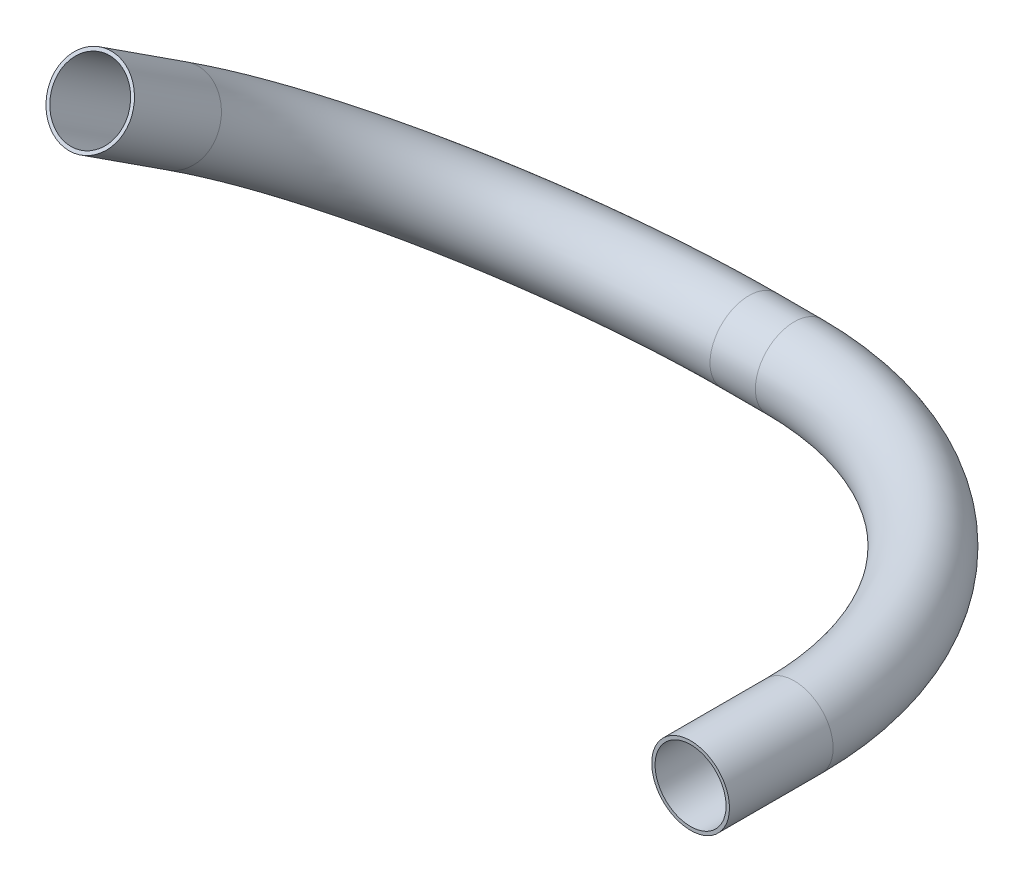
ISO-10303-21;
HEADER;
FILE_DESCRIPTION(('STEP AP214'),'2;1');
FILE_NAME('part.step','',(''),(''),'','','');
FILE_SCHEMA(('AUTOMOTIVE_DESIGN { 1 0 10303 214 1 1 1 1 }'));
ENDSEC;
DATA;
#1=APPLICATION_CONTEXT('core data for automotive mechanical design processes');
#2=APPLICATION_PROTOCOL_DEFINITION('international standard','automotive_design',2000,#1);
#3=PRODUCT_CONTEXT('',#1,'mechanical');
#4=PRODUCT('Part','Part','',(#3));
#5=PRODUCT_RELATED_PRODUCT_CATEGORY('part','',(#4));
#6=PRODUCT_DEFINITION_FORMATION('','',#4);
#7=PRODUCT_DEFINITION_CONTEXT('part definition',#1,'design');
#8=PRODUCT_DEFINITION('design','',#6,#7);
#9=PRODUCT_DEFINITION_SHAPE('','',#8);
#10=(LENGTH_UNIT() NAMED_UNIT(*) SI_UNIT(.MILLI.,.METRE.));
#11=(NAMED_UNIT(*) PLANE_ANGLE_UNIT() SI_UNIT($,.RADIAN.));
#12=(NAMED_UNIT(*) SI_UNIT($,.STERADIAN.) SOLID_ANGLE_UNIT());
#13=UNCERTAINTY_MEASURE_WITH_UNIT(LENGTH_MEASURE(1.E-05),#10,'distance_accuracy_value','');
#14=(GEOMETRIC_REPRESENTATION_CONTEXT(3) GLOBAL_UNCERTAINTY_ASSIGNED_CONTEXT((#13)) GLOBAL_UNIT_ASSIGNED_CONTEXT((#10,
#11,#12)) REPRESENTATION_CONTEXT('',''));
#15=CARTESIAN_POINT('',(0.,0.,0.));
#16=DIRECTION('',(0.,0.,1.));
#17=DIRECTION('',(1.,0.,0.));
#18=AXIS2_PLACEMENT_3D('',#15,#16,#17);
#19=CARTESIAN_POINT('',(174.624999999999,0.,-203.2));
#20=DIRECTION('',(-1.,0.,0.));
#21=DIRECTION('',(0.,0.,1.));
#22=AXIS2_PLACEMENT_3D('',#19,#20,#21);
#23=CYLINDRICAL_SURFACE('',#22,19.05);
#24=CARTESIAN_POINT('',(152.4,0.,-203.2));
#25=DIRECTION('',(-1.,0.,0.));
#26=DIRECTION('',(0.,-0.838670567945423,0.544639035015028));
#27=AXIS2_PLACEMENT_3D('',#24,#25,#26);
#28=CIRCLE('',#27,19.05);
#29=CARTESIAN_POINT('',(152.4,-10.3753736170363,-219.17667431936));
#30=VERTEX_POINT('',#29);
#31=EDGE_CURVE('E175',#30,#30,#28,.T.);
#32=ORIENTED_EDGE('',*,*,#31,.F.);
#33=EDGE_LOOP('',(#32));
#34=FACE_BOUND('',#33,.T.);
#35=CARTESIAN_POINT('',(174.624999999999,0.,-203.2));
#36=DIRECTION('',(-1.,0.,0.));
#37=DIRECTION('',(0.,-0.838670567945423,0.544639035015028));
#38=AXIS2_PLACEMENT_3D('',#35,#36,#37);
#39=CIRCLE('',#38,19.05);
#40=CARTESIAN_POINT('',(174.624999999999,0.,-222.25));
#41=VERTEX_POINT('',#40);
#42=EDGE_CURVE('E197',#41,#41,#39,.T.);
#43=ORIENTED_EDGE('',*,*,#42,.T.);
#44=EDGE_LOOP('',(#43));
#45=FACE_BOUND('',#44,.T.);
#46=ADVANCED_FACE('F145',(#34,#45),#23,.T.);
#47=CARTESIAN_POINT('',(152.4,83.0029889362903,-75.3866054451175));
#48=DIRECTION('',(0.,0.838670567945423,-0.544639035015028));
#49=DIRECTION('',(0.,0.544639035015028,0.838670567945423));
#50=AXIS2_PLACEMENT_3D('',#47,#48,#49);
#51=TOROIDAL_SURFACE('',#50,152.4,19.05);
#52=CARTESIAN_POINT('',(-2.58522689888991E-13,83.0029889362909,-75.3866054451165));
#53=DIRECTION('',(0.,0.544639035015028,0.838670567945423));
#54=DIRECTION('',(0.,-0.838670567945423,0.544639035015028));
#55=AXIS2_PLACEMENT_3D('',#52,#53,#54);
#56=CIRCLE('',#55,19.05);
#57=CARTESIAN_POINT('',(-19.05,83.0029889362909,-75.3866054451164));
#58=VERTEX_POINT('',#57);
#59=EDGE_CURVE('E149',#58,#58,#56,.T.);
#60=CARTESIAN_POINT('',(152.4,83.0029889362903,-75.3866054451175));
#61=DIRECTION('',(0.,0.838670567945423,-0.544639035015028));
#62=DIRECTION('',(0.,0.544639035015028,0.838670567945423));
#63=AXIS2_PLACEMENT_3D('',#60,#61,#62);
#64=CIRCLE('',#63,171.45);
#65=EDGE_CURVE('',#30,#58,#64,.T.);
#66=ORIENTED_EDGE('',*,*,#31,.T.);
#67=ORIENTED_EDGE('',*,*,#59,.F.);
#68=ORIENTED_EDGE('',*,*,#65,.T.);
#69=ORIENTED_EDGE('',*,*,#65,.F.);
#70=EDGE_LOOP('',(#66,#68,#67,#69));
#71=FACE_BOUND('',#70,.T.);
#72=ADVANCED_FACE('F205',(#71),#51,.T.);
#73=CARTESIAN_POINT('',(0.,83.0029889362909,-75.3866054451165));
#74=DIRECTION('',(0.,0.544639035015028,0.838670567945423));
#75=DIRECTION('',(0.,-0.838670567945423,0.544639035015028));
#76=AXIS2_PLACEMENT_3D('',#73,#74,#75);
#77=CYLINDRICAL_SURFACE('',#76,19.05);
#78=CARTESIAN_POINT('',(0.,110.670651915054,-32.78214059349));
#79=DIRECTION('',(0.,0.544639035015028,0.838670567945423));
#80=DIRECTION('',(0.,-0.838670567945423,0.544639035015028));
#81=AXIS2_PLACEMENT_3D('',#78,#79,#80);
#82=CIRCLE('',#81,19.05);
#83=CARTESIAN_POINT('',(0.,94.6939775956934,-22.4067669764537));
#84=VERTEX_POINT('',#83);
#85=EDGE_CURVE('E160',#84,#84,#82,.T.);
#86=ORIENTED_EDGE('',*,*,#85,.F.);
#87=EDGE_LOOP('',(#86));
#88=FACE_BOUND('',#87,.T.);
#89=ORIENTED_EDGE('',*,*,#59,.T.);
#90=EDGE_LOOP('',(#89));
#91=FACE_BOUND('',#90,.T.);
#92=ADVANCED_FACE('F147',(#88,#91),#77,.T.);
#93=CARTESIAN_POINT('',(0.,110.670651915054,-32.78214059349));
#94=DIRECTION('',(0.,0.544639035015028,0.838670567945423));
#95=DIRECTION('',(0.,-0.838670567945423,0.544639035015028));
#96=AXIS2_PLACEMENT_3D('',#93,#94,#95);
#97=PLANE('',#96);
#98=CARTESIAN_POINT('',(0.,110.670651915054,-32.78214059349));
#99=DIRECTION('',(0.,0.544639035015028,0.838670567945423));
#100=DIRECTION('',(0.,-0.838670567945423,0.544639035015028));
#101=AXIS2_PLACEMENT_3D('',#98,#99,#100);
#102=CIRCLE('',#101,17.399);
#103=CARTESIAN_POINT('',(0.,96.0786227033713,-23.3059660232635));
#104=VERTEX_POINT('',#103);
#105=EDGE_CURVE('E13',#104,#104,#102,.F.);
#106=ORIENTED_EDGE('',*,*,#105,.T.);
#107=EDGE_LOOP('',(#106));
#108=FACE_BOUND('',#107,.T.);
#109=ORIENTED_EDGE('',*,*,#85,.T.);
#110=EDGE_LOOP('',(#109));
#111=FACE_BOUND('',#110,.T.);
#112=ADVANCED_FACE('F237',(#108,#111),#97,.T.);
#113=CARTESIAN_POINT('',(174.624999999999,0.,-203.2));
#114=DIRECTION('',(-1.,0.,0.));
#115=DIRECTION('',(0.,0.,1.));
#116=AXIS2_PLACEMENT_3D('',#113,#114,#115);
#117=CYLINDRICAL_SURFACE('',#116,17.399);
#118=CARTESIAN_POINT('',(152.4,0.,-203.2));
#119=DIRECTION('',(-1.,0.,0.));
#120=DIRECTION('',(0.,-0.838670567945423,0.544639035015028));
#121=AXIS2_PLACEMENT_3D('',#118,#119,#120);
#122=CIRCLE('',#121,17.399);
#123=CARTESIAN_POINT('',(152.4,-9.4761745702265,-217.792029211682));
#124=VERTEX_POINT('',#123);
#125=EDGE_CURVE('E191',#124,#124,#122,.F.);
#126=ORIENTED_EDGE('',*,*,#125,.F.);
#127=EDGE_LOOP('',(#126));
#128=FACE_BOUND('',#127,.T.);
#129=CARTESIAN_POINT('',(174.624999999999,0.,-203.2));
#130=DIRECTION('',(-1.,0.,0.));
#131=DIRECTION('',(0.,-0.838670567945423,0.544639035015028));
#132=AXIS2_PLACEMENT_3D('',#129,#130,#131);
#133=CIRCLE('',#132,17.399);
#134=CARTESIAN_POINT('',(174.624999999999,0.,-220.599));
#135=VERTEX_POINT('',#134);
#136=EDGE_CURVE('E188',#135,#135,#133,.F.);
#137=ORIENTED_EDGE('',*,*,#136,.T.);
#138=EDGE_LOOP('',(#137));
#139=FACE_BOUND('',#138,.T.);
#140=ADVANCED_FACE('F232',(#128,#139),#117,.F.);
#141=CARTESIAN_POINT('',(152.4,83.0029889362903,-75.3866054451175));
#142=DIRECTION('',(0.,0.838670567945423,-0.544639035015028));
#143=DIRECTION('',(0.,0.544639035015028,0.838670567945423));
#144=AXIS2_PLACEMENT_3D('',#141,#142,#143);
#145=TOROIDAL_SURFACE('',#144,152.4,17.399);
#146=CARTESIAN_POINT('',(-2.58522689888991E-13,83.0029889362909,-75.3866054451165));
#147=DIRECTION('',(0.,0.544639035015028,0.838670567945423));
#148=DIRECTION('',(0.,-0.838670567945423,0.544639035015028));
#149=AXIS2_PLACEMENT_3D('',#146,#147,#148);
#150=CIRCLE('',#149,17.399);
#151=CARTESIAN_POINT('',(-17.399,83.0029889362909,-75.3866054451164));
#152=VERTEX_POINT('',#151);
#153=EDGE_CURVE('E154',#152,#152,#150,.F.);
#154=CARTESIAN_POINT('',(152.4,83.0029889362903,-75.3866054451175));
#155=DIRECTION('',(0.,0.838670567945423,-0.544639035015028));
#156=DIRECTION('',(0.,0.544639035015028,0.838670567945423));
#157=AXIS2_PLACEMENT_3D('',#154,#155,#156);
#158=CIRCLE('',#157,169.799);
#159=EDGE_CURVE('',#124,#152,#158,.T.);
#160=ORIENTED_EDGE('',*,*,#125,.T.);
#161=ORIENTED_EDGE('',*,*,#153,.F.);
#162=ORIENTED_EDGE('',*,*,#159,.T.);
#163=ORIENTED_EDGE('',*,*,#159,.F.);
#164=EDGE_LOOP('',(#160,#162,#161,#163));
#165=FACE_BOUND('',#164,.T.);
#166=ADVANCED_FACE('F222',(#165),#145,.F.);
#167=CARTESIAN_POINT('',(0.,83.0029889362909,-75.3866054451165));
#168=DIRECTION('',(0.,0.544639035015028,0.838670567945423));
#169=DIRECTION('',(0.,-0.838670567945423,0.544639035015028));
#170=AXIS2_PLACEMENT_3D('',#167,#168,#169);
#171=CYLINDRICAL_SURFACE('',#170,17.399);
#172=ORIENTED_EDGE('',*,*,#105,.F.);
#173=EDGE_LOOP('',(#172));
#174=FACE_BOUND('',#173,.T.);
#175=ORIENTED_EDGE('',*,*,#153,.T.);
#176=EDGE_LOOP('',(#175));
#177=FACE_BOUND('',#176,.T.);
#178=ADVANCED_FACE('F219',(#174,#177),#171,.F.);
#179=CARTESIAN_POINT('',(174.625,0.,-50.8));
#180=DIRECTION('',(0.,-1.,0.));
#181=DIRECTION('',(0.,0.,-1.));
#182=AXIS2_PLACEMENT_3D('',#179,#180,#181);
#183=TOROIDAL_SURFACE('',#182,152.4,19.05);
#184=CARTESIAN_POINT('',(327.025,0.,-50.799999999999));
#185=DIRECTION('',(0.,0.,1.));
#186=DIRECTION('',(1.,0.,0.));
#187=AXIS2_PLACEMENT_3D('',#184,#185,#186);
#188=CIRCLE('',#187,19.05);
#189=CARTESIAN_POINT('',(346.075,0.,-50.7999999999989));
#190=VERTEX_POINT('',#189);
#191=EDGE_CURVE('E185',#190,#190,#188,.T.);
#192=CARTESIAN_POINT('',(174.625,0.,-50.8));
#193=DIRECTION('',(0.,-1.,0.));
#194=DIRECTION('',(0.,0.,-1.));
#195=AXIS2_PLACEMENT_3D('',#192,#193,#194);
#196=CIRCLE('',#195,171.45);
#197=EDGE_CURVE('',#41,#190,#196,.T.);
#198=ORIENTED_EDGE('',*,*,#42,.F.);
#199=ORIENTED_EDGE('',*,*,#191,.F.);
#200=ORIENTED_EDGE('',*,*,#197,.T.);
#201=ORIENTED_EDGE('',*,*,#197,.F.);
#202=EDGE_LOOP('',(#198,#200,#199,#201));
#203=FACE_BOUND('',#202,.T.);
#204=ADVANCED_FACE('F221',(#203),#183,.T.);
#205=CARTESIAN_POINT('',(327.025,0.,-50.799999999999));
#206=DIRECTION('',(0.,0.,1.));
#207=DIRECTION('',(1.,0.,0.));
#208=AXIS2_PLACEMENT_3D('',#205,#206,#207);
#209=CYLINDRICAL_SURFACE('',#208,19.05);
#210=CARTESIAN_POINT('',(327.025,0.,0.));
#211=DIRECTION('',(0.,0.,1.));
#212=DIRECTION('',(1.,0.,0.));
#213=AXIS2_PLACEMENT_3D('',#210,#211,#212);
#214=CIRCLE('',#213,19.05);
#215=CARTESIAN_POINT('',(346.075,0.,0.));
#216=VERTEX_POINT('',#215);
#217=EDGE_CURVE('E180',#216,#216,#214,.T.);
#218=ORIENTED_EDGE('',*,*,#217,.F.);
#219=EDGE_LOOP('',(#218));
#220=FACE_BOUND('',#219,.T.);
#221=ORIENTED_EDGE('',*,*,#191,.T.);
#222=EDGE_LOOP('',(#221));
#223=FACE_BOUND('',#222,.T.);
#224=ADVANCED_FACE('F229',(#220,#223),#209,.T.);
#225=CARTESIAN_POINT('',(327.025,0.,0.));
#226=DIRECTION('',(0.,0.,1.));
#227=DIRECTION('',(1.,0.,0.));
#228=AXIS2_PLACEMENT_3D('',#225,#226,#227);
#229=PLANE('',#228);
#230=CARTESIAN_POINT('',(327.025,0.,0.));
#231=DIRECTION('',(0.,0.,1.));
#232=DIRECTION('',(1.,0.,0.));
#233=AXIS2_PLACEMENT_3D('',#230,#231,#232);
#234=CIRCLE('',#233,17.399);
#235=CARTESIAN_POINT('',(344.424,0.,0.));
#236=VERTEX_POINT('',#235);
#237=EDGE_CURVE('E171',#236,#236,#234,.F.);
#238=ORIENTED_EDGE('',*,*,#237,.T.);
#239=EDGE_LOOP('',(#238));
#240=FACE_BOUND('',#239,.T.);
#241=ORIENTED_EDGE('',*,*,#217,.T.);
#242=EDGE_LOOP('',(#241));
#243=FACE_BOUND('',#242,.T.);
#244=ADVANCED_FACE('F172',(#240,#243),#229,.T.);
#245=CARTESIAN_POINT('',(174.625,0.,-50.8));
#246=DIRECTION('',(0.,-1.,0.));
#247=DIRECTION('',(0.,0.,-1.));
#248=AXIS2_PLACEMENT_3D('',#245,#246,#247);
#249=TOROIDAL_SURFACE('',#248,152.4,17.399);
#250=CARTESIAN_POINT('',(327.025,0.,-50.799999999999));
#251=DIRECTION('',(0.,0.,1.));
#252=DIRECTION('',(1.,0.,0.));
#253=AXIS2_PLACEMENT_3D('',#250,#251,#252);
#254=CIRCLE('',#253,17.399);
#255=CARTESIAN_POINT('',(344.424,0.,-50.7999999999989));
#256=VERTEX_POINT('',#255);
#257=EDGE_CURVE('E176',#256,#256,#254,.F.);
#258=CARTESIAN_POINT('',(174.625,0.,-50.8));
#259=DIRECTION('',(0.,-1.,0.));
#260=DIRECTION('',(0.,0.,-1.));
#261=AXIS2_PLACEMENT_3D('',#258,#259,#260);
#262=CIRCLE('',#261,169.799);
#263=EDGE_CURVE('',#135,#256,#262,.T.);
#264=ORIENTED_EDGE('',*,*,#136,.F.);
#265=ORIENTED_EDGE('',*,*,#257,.F.);
#266=ORIENTED_EDGE('',*,*,#263,.T.);
#267=ORIENTED_EDGE('',*,*,#263,.F.);
#268=EDGE_LOOP('',(#264,#266,#265,#267));
#269=FACE_BOUND('',#268,.T.);
#270=ADVANCED_FACE('F217',(#269),#249,.F.);
#271=CARTESIAN_POINT('',(327.025,0.,-50.799999999999));
#272=DIRECTION('',(0.,0.,1.));
#273=DIRECTION('',(1.,0.,0.));
#274=AXIS2_PLACEMENT_3D('',#271,#272,#273);
#275=CYLINDRICAL_SURFACE('',#274,17.399);
#276=ORIENTED_EDGE('',*,*,#237,.F.);
#277=EDGE_LOOP('',(#276));
#278=FACE_BOUND('',#277,.T.);
#279=ORIENTED_EDGE('',*,*,#257,.T.);
#280=EDGE_LOOP('',(#279));
#281=FACE_BOUND('',#280,.T.);
#282=ADVANCED_FACE('F212',(#278,#281),#275,.F.);
#283=CLOSED_SHELL('',(#46,#72,#92,#112,#140,#166,#178,#204,#224,#244,#270,#282));
#284=MANIFOLD_SOLID_BREP('B2',#283);
#285=ADVANCED_BREP_SHAPE_REPRESENTATION('',(#18,#284),#14);
#286=SHAPE_DEFINITION_REPRESENTATION(#9,#285);
ENDSEC;
END-ISO-10303-21;
